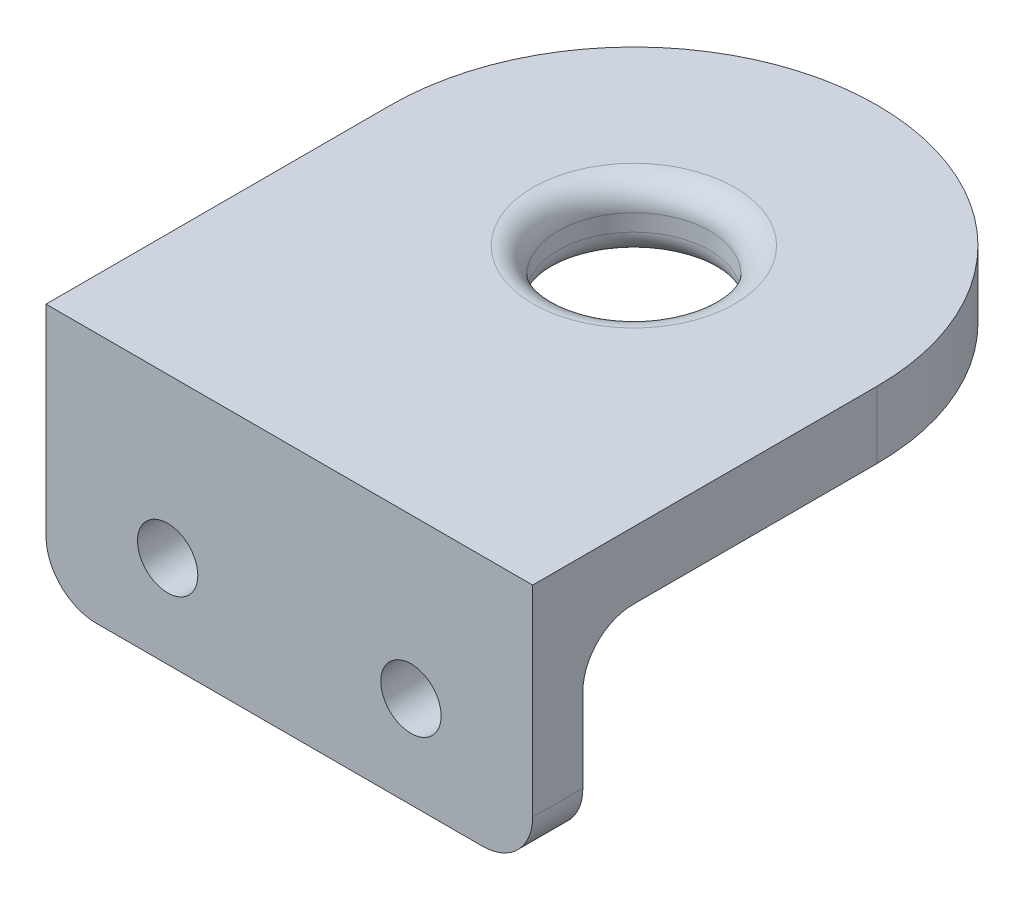
ISO-10303-21;
HEADER;
FILE_DESCRIPTION(('STEP AP214'),'2;1');
FILE_NAME('part.step','',(''),(''),'','','');
FILE_SCHEMA(('AUTOMOTIVE_DESIGN { 1 0 10303 214 1 1 1 1 }'));
ENDSEC;
DATA;
#1=APPLICATION_CONTEXT('core data for automotive mechanical design processes');
#2=APPLICATION_PROTOCOL_DEFINITION('international standard','automotive_design',2000,#1);
#3=PRODUCT_CONTEXT('',#1,'mechanical');
#4=PRODUCT('Part','Part','',(#3));
#5=PRODUCT_RELATED_PRODUCT_CATEGORY('part','',(#4));
#6=PRODUCT_DEFINITION_FORMATION('','',#4);
#7=PRODUCT_DEFINITION_CONTEXT('part definition',#1,'design');
#8=PRODUCT_DEFINITION('design','',#6,#7);
#9=PRODUCT_DEFINITION_SHAPE('','',#8);
#10=(LENGTH_UNIT() NAMED_UNIT(*) SI_UNIT(.MILLI.,.METRE.));
#11=(NAMED_UNIT(*) PLANE_ANGLE_UNIT() SI_UNIT($,.RADIAN.));
#12=(NAMED_UNIT(*) SI_UNIT($,.STERADIAN.) SOLID_ANGLE_UNIT());
#13=UNCERTAINTY_MEASURE_WITH_UNIT(LENGTH_MEASURE(1.E-05),#10,'distance_accuracy_value','');
#14=(GEOMETRIC_REPRESENTATION_CONTEXT(3) GLOBAL_UNCERTAINTY_ASSIGNED_CONTEXT((#13)) GLOBAL_UNIT_ASSIGNED_CONTEXT((#10,
#11,#12)) REPRESENTATION_CONTEXT('',''));
#15=CARTESIAN_POINT('',(0.,0.,0.));
#16=DIRECTION('',(0.,0.,1.));
#17=DIRECTION('',(1.,0.,0.));
#18=AXIS2_PLACEMENT_3D('',#15,#16,#17);
#19=CARTESIAN_POINT('',(0.,0.,-20.57));
#20=DIRECTION('',(0.,1.,0.));
#21=DIRECTION('',(0.,0.,1.));
#22=AXIS2_PLACEMENT_3D('',#19,#20,#21);
#23=PLANE('',#22);
#24=CARTESIAN_POINT('',(0.,0.,-20.57));
#25=DIRECTION('',(0.,1.,0.));
#26=DIRECTION('',(0.,0.,1.));
#27=AXIS2_PLACEMENT_3D('',#24,#25,#26);
#28=CIRCLE('',#27,6.025);
#29=CARTESIAN_POINT('',(0.,0.,-14.545));
#30=VERTEX_POINT('',#29);
#31=EDGE_CURVE('E161',#30,#30,#28,.T.);
#32=ORIENTED_EDGE('',*,*,#31,.T.);
#33=EDGE_LOOP('',(#32));
#34=FACE_BOUND('',#33,.T.);
#35=DIRECTION('',(0.,0.,-1.));
#36=VECTOR('',#35,1.);
#37=CARTESIAN_POINT('',(14.525,0.,0.));
#38=LINE('',#37,#36);
#39=CARTESIAN_POINT('',(14.525,0.,-6.));
#40=VERTEX_POINT('',#39);
#41=CARTESIAN_POINT('',(14.525,0.,-20.57));
#42=VERTEX_POINT('',#41);
#43=EDGE_CURVE('E127',#40,#42,#38,.T.);
#44=ORIENTED_EDGE('',*,*,#43,.F.);
#45=DIRECTION('',(1.,0.,0.));
#46=VECTOR('',#45,1.);
#47=CARTESIAN_POINT('',(-14.525,0.,-6.));
#48=LINE('',#47,#46);
#49=CARTESIAN_POINT('',(-14.525,0.,-6.));
#50=VERTEX_POINT('',#49);
#51=EDGE_CURVE('E156',#40,#50,#48,.F.);
#52=ORIENTED_EDGE('',*,*,#51,.T.);
#53=DIRECTION('',(0.,0.,1.));
#54=VECTOR('',#53,1.);
#55=CARTESIAN_POINT('',(-14.525,0.,-20.57));
#56=LINE('',#55,#54);
#57=CARTESIAN_POINT('',(-14.525,0.,-20.57));
#58=VERTEX_POINT('',#57);
#59=EDGE_CURVE('E181',#58,#50,#56,.T.);
#60=ORIENTED_EDGE('',*,*,#59,.F.);
#61=CARTESIAN_POINT('',(0.,0.,-20.57));
#62=DIRECTION('',(0.,1.,0.));
#63=DIRECTION('',(0.,0.,1.));
#64=AXIS2_PLACEMENT_3D('',#61,#62,#63);
#65=CIRCLE('',#64,14.525);
#66=EDGE_CURVE('E131',#42,#58,#65,.T.);
#67=ORIENTED_EDGE('',*,*,#66,.F.);
#68=EDGE_LOOP('',(#44,#52,#60,#67));
#69=FACE_BOUND('',#68,.T.);
#70=ADVANCED_FACE('F33',(#34,#69),#23,.F.);
#71=CARTESIAN_POINT('',(0.,4.,-20.57));
#72=DIRECTION('',(0.,1.,0.));
#73=DIRECTION('',(0.,0.,1.));
#74=AXIS2_PLACEMENT_3D('',#71,#72,#73);
#75=PLANE('',#74);
#76=CARTESIAN_POINT('',(0.,4.,-20.57));
#77=DIRECTION('',(0.,1.,0.));
#78=DIRECTION('',(0.,0.,1.));
#79=AXIS2_PLACEMENT_3D('',#76,#77,#78);
#80=CIRCLE('',#79,6.025);
#81=CARTESIAN_POINT('',(0.,4.,-14.545));
#82=VERTEX_POINT('',#81);
#83=EDGE_CURVE('E11',#82,#82,#80,.F.);
#84=ORIENTED_EDGE('',*,*,#83,.T.);
#85=EDGE_LOOP('',(#84));
#86=FACE_BOUND('',#85,.T.);
#87=DIRECTION('',(0.,0.,-1.));
#88=VECTOR('',#87,1.);
#89=CARTESIAN_POINT('',(14.525,4.,0.));
#90=LINE('',#89,#88);
#91=CARTESIAN_POINT('',(14.525,4.,0.));
#92=VERTEX_POINT('',#91);
#93=CARTESIAN_POINT('',(14.525,4.,-20.57));
#94=VERTEX_POINT('',#93);
#95=EDGE_CURVE('E123',#92,#94,#90,.T.);
#96=ORIENTED_EDGE('',*,*,#95,.T.);
#97=CARTESIAN_POINT('',(0.,4.,-20.57));
#98=DIRECTION('',(0.,1.,0.));
#99=DIRECTION('',(0.,0.,1.));
#100=AXIS2_PLACEMENT_3D('',#97,#98,#99);
#101=CIRCLE('',#100,14.525);
#102=CARTESIAN_POINT('',(-14.525,4.,-20.57));
#103=VERTEX_POINT('',#102);
#104=EDGE_CURVE('E118',#94,#103,#101,.T.);
#105=ORIENTED_EDGE('',*,*,#104,.T.);
#106=DIRECTION('',(0.,0.,1.));
#107=VECTOR('',#106,1.);
#108=CARTESIAN_POINT('',(-14.525,4.,-20.57));
#109=LINE('',#108,#107);
#110=CARTESIAN_POINT('',(-14.525,4.,0.));
#111=VERTEX_POINT('',#110);
#112=EDGE_CURVE('E104',#103,#111,#109,.T.);
#113=ORIENTED_EDGE('',*,*,#112,.T.);
#114=DIRECTION('',(1.,0.,0.));
#115=VECTOR('',#114,1.);
#116=CARTESIAN_POINT('',(-14.525,4.,0.));
#117=LINE('',#116,#115);
#118=EDGE_CURVE('E117',#111,#92,#117,.T.);
#119=ORIENTED_EDGE('',*,*,#118,.T.);
#120=EDGE_LOOP('',(#96,#105,#113,#119));
#121=FACE_BOUND('',#120,.T.);
#122=ADVANCED_FACE('F121',(#86,#121),#75,.T.);
#123=CARTESIAN_POINT('',(0.,4.,-20.57));
#124=DIRECTION('',(0.,-1.,0.));
#125=DIRECTION('',(0.,0.,-1.));
#126=AXIS2_PLACEMENT_3D('',#123,#124,#125);
#127=CYLINDRICAL_SURFACE('',#126,14.525);
#128=ORIENTED_EDGE('',*,*,#66,.T.);
#129=DIRECTION('',(0.,-1.,0.));
#130=VECTOR('',#129,1.);
#131=CARTESIAN_POINT('',(-14.525,4.,-20.57));
#132=LINE('',#131,#130);
#133=EDGE_CURVE('E110',#103,#58,#132,.T.);
#134=ORIENTED_EDGE('',*,*,#133,.F.);
#135=ORIENTED_EDGE('',*,*,#104,.F.);
#136=DIRECTION('',(0.,-1.,0.));
#137=VECTOR('',#136,1.);
#138=CARTESIAN_POINT('',(14.525,4.,-20.57));
#139=LINE('',#138,#137);
#140=EDGE_CURVE('E208',#94,#42,#139,.T.);
#141=ORIENTED_EDGE('',*,*,#140,.T.);
#142=EDGE_LOOP('',(#128,#134,#135,#141));
#143=FACE_BOUND('',#142,.T.);
#144=ADVANCED_FACE('F129',(#143),#127,.T.);
#145=CARTESIAN_POINT('',(-14.525,4.,-20.57));
#146=DIRECTION('',(1.,0.,0.));
#147=DIRECTION('',(0.,0.,-1.));
#148=AXIS2_PLACEMENT_3D('',#145,#146,#147);
#149=PLANE('',#148);
#150=DIRECTION('',(0.,-1.,0.));
#151=VECTOR('',#150,1.);
#152=CARTESIAN_POINT('',(-14.525,4.,-3.));
#153=LINE('',#152,#151);
#154=CARTESIAN_POINT('',(-14.525,-3.,-3.));
#155=VERTEX_POINT('',#154);
#156=CARTESIAN_POINT('',(-14.525,-8.,-3.));
#157=VERTEX_POINT('',#156);
#158=EDGE_CURVE('E185',#155,#157,#153,.T.);
#159=ORIENTED_EDGE('',*,*,#158,.T.);
#160=DIRECTION('',(0.,0.,1.));
#161=VECTOR('',#160,1.);
#162=CARTESIAN_POINT('',(-14.525,-8.,0.));
#163=LINE('',#162,#161);
#164=CARTESIAN_POINT('',(-14.525,-8.,0.));
#165=VERTEX_POINT('',#164);
#166=EDGE_CURVE('E132',#157,#165,#163,.T.);
#167=ORIENTED_EDGE('',*,*,#166,.T.);
#168=DIRECTION('',(0.,-1.,0.));
#169=VECTOR('',#168,1.);
#170=CARTESIAN_POINT('',(-14.525,4.,0.));
#171=LINE('',#170,#169);
#172=EDGE_CURVE('E114',#111,#165,#171,.T.);
#173=ORIENTED_EDGE('',*,*,#172,.F.);
#174=ORIENTED_EDGE('',*,*,#112,.F.);
#175=ORIENTED_EDGE('',*,*,#133,.T.);
#176=ORIENTED_EDGE('',*,*,#59,.T.);
#177=CARTESIAN_POINT('',(-14.525,-3.,-6.));
#178=DIRECTION('',(1.,0.,0.));
#179=DIRECTION('',(0.,0.,-1.));
#180=AXIS2_PLACEMENT_3D('',#177,#178,#179);
#181=CIRCLE('',#180,3.);
#182=EDGE_CURVE('E159',#50,#155,#181,.T.);
#183=ORIENTED_EDGE('',*,*,#182,.T.);
#184=EDGE_LOOP('',(#159,#167,#173,#174,#175,#176,#183));
#185=FACE_BOUND('',#184,.T.);
#186=ADVANCED_FACE('F107',(#185),#149,.F.);
#187=CARTESIAN_POINT('',(-14.525,4.,0.));
#188=DIRECTION('',(0.,0.,-1.));
#189=DIRECTION('',(-1.,0.,0.));
#190=AXIS2_PLACEMENT_3D('',#187,#188,#189);
#191=PLANE('',#190);
#192=CARTESIAN_POINT('',(7.2625,-5.5,0.));
#193=DIRECTION('',(0.,0.,-1.));
#194=DIRECTION('',(-1.,0.,0.));
#195=AXIS2_PLACEMENT_3D('',#192,#193,#194);
#196=CIRCLE('',#195,1.8);
#197=CARTESIAN_POINT('',(5.4625,-5.5,0.));
#198=VERTEX_POINT('',#197);
#199=EDGE_CURVE('E199',#198,#198,#196,.T.);
#200=ORIENTED_EDGE('',*,*,#199,.T.);
#201=EDGE_LOOP('',(#200));
#202=FACE_BOUND('',#201,.T.);
#203=CARTESIAN_POINT('',(-7.2625,-5.5,0.));
#204=DIRECTION('',(0.,0.,-1.));
#205=DIRECTION('',(1.,0.,0.));
#206=AXIS2_PLACEMENT_3D('',#203,#204,#205);
#207=CIRCLE('',#206,1.8);
#208=CARTESIAN_POINT('',(-5.4625,-5.5,0.));
#209=VERTEX_POINT('',#208);
#210=EDGE_CURVE('E379',#209,#209,#207,.T.);
#211=ORIENTED_EDGE('',*,*,#210,.T.);
#212=EDGE_LOOP('',(#211));
#213=FACE_BOUND('',#212,.T.);
#214=ORIENTED_EDGE('',*,*,#172,.T.);
#215=CARTESIAN_POINT('',(-11.525,-8.,0.));
#216=DIRECTION('',(0.,0.,-1.));
#217=DIRECTION('',(-1.,0.,0.));
#218=AXIS2_PLACEMENT_3D('',#215,#216,#217);
#219=CIRCLE('',#218,3.);
#220=CARTESIAN_POINT('',(-11.525,-11.,0.));
#221=VERTEX_POINT('',#220);
#222=EDGE_CURVE('E141',#165,#221,#219,.F.);
#223=ORIENTED_EDGE('',*,*,#222,.T.);
#224=DIRECTION('',(1.,0.,0.));
#225=VECTOR('',#224,1.);
#226=CARTESIAN_POINT('',(-14.525,-11.,0.));
#227=LINE('',#226,#225);
#228=CARTESIAN_POINT('',(11.525,-11.,0.));
#229=VERTEX_POINT('',#228);
#230=EDGE_CURVE('E193',#221,#229,#227,.T.);
#231=ORIENTED_EDGE('',*,*,#230,.T.);
#232=CARTESIAN_POINT('',(11.525,-8.,0.));
#233=DIRECTION('',(0.,0.,-1.));
#234=DIRECTION('',(-1.,0.,0.));
#235=AXIS2_PLACEMENT_3D('',#232,#233,#234);
#236=CIRCLE('',#235,3.);
#237=CARTESIAN_POINT('',(14.525,-8.,0.));
#238=VERTEX_POINT('',#237);
#239=EDGE_CURVE('E134',#229,#238,#236,.F.);
#240=ORIENTED_EDGE('',*,*,#239,.T.);
#241=DIRECTION('',(0.,-1.,0.));
#242=VECTOR('',#241,1.);
#243=CARTESIAN_POINT('',(14.525,4.,0.));
#244=LINE('',#243,#242);
#245=EDGE_CURVE('E136',#92,#238,#244,.T.);
#246=ORIENTED_EDGE('',*,*,#245,.F.);
#247=ORIENTED_EDGE('',*,*,#118,.F.);
#248=EDGE_LOOP('',(#214,#223,#231,#240,#246,#247));
#249=FACE_BOUND('',#248,.T.);
#250=ADVANCED_FACE('F226',(#202,#213,#249),#191,.F.);
#251=CARTESIAN_POINT('',(14.525,4.,0.));
#252=DIRECTION('',(-1.,0.,0.));
#253=DIRECTION('',(0.,0.,1.));
#254=AXIS2_PLACEMENT_3D('',#251,#252,#253);
#255=PLANE('',#254);
#256=ORIENTED_EDGE('',*,*,#245,.T.);
#257=DIRECTION('',(0.,0.,1.));
#258=VECTOR('',#257,1.);
#259=CARTESIAN_POINT('',(14.525,-8.,-3.));
#260=LINE('',#259,#258);
#261=CARTESIAN_POINT('',(14.525,-8.,-3.));
#262=VERTEX_POINT('',#261);
#263=EDGE_CURVE('E154',#238,#262,#260,.F.);
#264=ORIENTED_EDGE('',*,*,#263,.T.);
#265=DIRECTION('',(0.,1.,0.));
#266=VECTOR('',#265,1.);
#267=CARTESIAN_POINT('',(14.525,4.,-3.));
#268=LINE('',#267,#266);
#269=CARTESIAN_POINT('',(14.525,-3.,-3.));
#270=VERTEX_POINT('',#269);
#271=EDGE_CURVE('E196',#262,#270,#268,.T.);
#272=ORIENTED_EDGE('',*,*,#271,.T.);
#273=CARTESIAN_POINT('',(14.525,-3.,-6.));
#274=DIRECTION('',(-1.,0.,0.));
#275=DIRECTION('',(0.,0.,1.));
#276=AXIS2_PLACEMENT_3D('',#273,#274,#275);
#277=CIRCLE('',#276,3.);
#278=EDGE_CURVE('E48',#270,#40,#277,.T.);
#279=ORIENTED_EDGE('',*,*,#278,.T.);
#280=ORIENTED_EDGE('',*,*,#43,.T.);
#281=ORIENTED_EDGE('',*,*,#140,.F.);
#282=ORIENTED_EDGE('',*,*,#95,.F.);
#283=EDGE_LOOP('',(#256,#264,#272,#279,#280,#281,#282));
#284=FACE_BOUND('',#283,.T.);
#285=ADVANCED_FACE('F214',(#284),#255,.F.);
#286=CARTESIAN_POINT('',(0.,4.,-20.57));
#287=DIRECTION('',(0.,-1.,0.));
#288=DIRECTION('',(0.,0.,-1.));
#289=AXIS2_PLACEMENT_3D('',#286,#287,#288);
#290=CYLINDRICAL_SURFACE('',#289,4.525);
#291=CARTESIAN_POINT('',(0.,1.5,-20.57));
#292=DIRECTION('',(0.,1.,0.));
#293=DIRECTION('',(0.,0.,1.));
#294=AXIS2_PLACEMENT_3D('',#291,#292,#293);
#295=CIRCLE('',#294,4.525);
#296=CARTESIAN_POINT('',(0.,1.5,-16.045));
#297=VERTEX_POINT('',#296);
#298=EDGE_CURVE('E41',#297,#297,#295,.F.);
#299=ORIENTED_EDGE('',*,*,#298,.T.);
#300=EDGE_LOOP('',(#299));
#301=FACE_BOUND('',#300,.T.);
#302=CARTESIAN_POINT('',(0.,2.5,-20.57));
#303=DIRECTION('',(0.,1.,0.));
#304=DIRECTION('',(0.,0.,1.));
#305=AXIS2_PLACEMENT_3D('',#302,#303,#304);
#306=CIRCLE('',#305,4.525);
#307=CARTESIAN_POINT('',(0.,2.5,-16.045));
#308=VERTEX_POINT('',#307);
#309=EDGE_CURVE('E164',#308,#308,#306,.T.);
#310=ORIENTED_EDGE('',*,*,#309,.T.);
#311=EDGE_LOOP('',(#310));
#312=FACE_BOUND('',#311,.T.);
#313=ADVANCED_FACE('F169',(#301,#312),#290,.F.);
#314=CARTESIAN_POINT('',(0.,0.,-3.));
#315=DIRECTION('',(0.,0.,1.));
#316=DIRECTION('',(1.,0.,0.));
#317=AXIS2_PLACEMENT_3D('',#314,#315,#316);
#318=PLANE('',#317);
#319=CARTESIAN_POINT('',(7.2625,-5.5,-3.));
#320=DIRECTION('',(0.,0.,-1.));
#321=DIRECTION('',(-1.,0.,0.));
#322=AXIS2_PLACEMENT_3D('',#319,#320,#321);
#323=CIRCLE('',#322,1.8);
#324=CARTESIAN_POINT('',(5.4625,-5.5,-3.));
#325=VERTEX_POINT('',#324);
#326=EDGE_CURVE('E375',#325,#325,#323,.T.);
#327=ORIENTED_EDGE('',*,*,#326,.F.);
#328=EDGE_LOOP('',(#327));
#329=FACE_BOUND('',#328,.T.);
#330=CARTESIAN_POINT('',(-7.2625,-5.5,-3.));
#331=DIRECTION('',(0.,0.,-1.));
#332=DIRECTION('',(1.,0.,0.));
#333=AXIS2_PLACEMENT_3D('',#330,#331,#332);
#334=CIRCLE('',#333,1.8);
#335=CARTESIAN_POINT('',(-5.4625,-5.5,-3.));
#336=VERTEX_POINT('',#335);
#337=EDGE_CURVE('E202',#336,#336,#334,.T.);
#338=ORIENTED_EDGE('',*,*,#337,.F.);
#339=EDGE_LOOP('',(#338));
#340=FACE_BOUND('',#339,.T.);
#341=DIRECTION('',(1.,0.,0.));
#342=VECTOR('',#341,1.);
#343=CARTESIAN_POINT('',(-14.525,-11.,-3.));
#344=LINE('',#343,#342);
#345=CARTESIAN_POINT('',(-11.525,-11.,-3.));
#346=VERTEX_POINT('',#345);
#347=CARTESIAN_POINT('',(11.525,-11.,-3.));
#348=VERTEX_POINT('',#347);
#349=EDGE_CURVE('E192',#346,#348,#344,.T.);
#350=ORIENTED_EDGE('',*,*,#349,.F.);
#351=CARTESIAN_POINT('',(-11.525,-8.,-3.));
#352=DIRECTION('',(0.,0.,1.));
#353=DIRECTION('',(1.,0.,0.));
#354=AXIS2_PLACEMENT_3D('',#351,#352,#353);
#355=CIRCLE('',#354,3.);
#356=EDGE_CURVE('E152',#346,#157,#355,.F.);
#357=ORIENTED_EDGE('',*,*,#356,.T.);
#358=ORIENTED_EDGE('',*,*,#158,.F.);
#359=DIRECTION('',(1.,0.,0.));
#360=VECTOR('',#359,1.);
#361=CARTESIAN_POINT('',(14.525,-3.,-3.));
#362=LINE('',#361,#360);
#363=EDGE_CURVE('E148',#155,#270,#362,.T.);
#364=ORIENTED_EDGE('',*,*,#363,.T.);
#365=ORIENTED_EDGE('',*,*,#271,.F.);
#366=CARTESIAN_POINT('',(11.525,-8.,-3.));
#367=DIRECTION('',(0.,0.,1.));
#368=DIRECTION('',(1.,0.,0.));
#369=AXIS2_PLACEMENT_3D('',#366,#367,#368);
#370=CIRCLE('',#369,3.);
#371=EDGE_CURVE('E150',#262,#348,#370,.F.);
#372=ORIENTED_EDGE('',*,*,#371,.T.);
#373=EDGE_LOOP('',(#350,#357,#358,#364,#365,#372));
#374=FACE_BOUND('',#373,.T.);
#375=ADVANCED_FACE('F189',(#329,#340,#374),#318,.F.);
#376=CARTESIAN_POINT('',(-14.525,-11.,-3.));
#377=DIRECTION('',(0.,-1.,0.));
#378=DIRECTION('',(0.,0.,-1.));
#379=AXIS2_PLACEMENT_3D('',#376,#377,#378);
#380=PLANE('',#379);
#381=ORIENTED_EDGE('',*,*,#230,.F.);
#382=DIRECTION('',(0.,0.,1.));
#383=VECTOR('',#382,1.);
#384=CARTESIAN_POINT('',(-11.525,-11.,-3.));
#385=LINE('',#384,#383);
#386=EDGE_CURVE('E146',#221,#346,#385,.F.);
#387=ORIENTED_EDGE('',*,*,#386,.T.);
#388=ORIENTED_EDGE('',*,*,#349,.T.);
#389=DIRECTION('',(0.,0.,1.));
#390=VECTOR('',#389,1.);
#391=CARTESIAN_POINT('',(11.525,-11.,0.));
#392=LINE('',#391,#390);
#393=EDGE_CURVE('E143',#348,#229,#392,.T.);
#394=ORIENTED_EDGE('',*,*,#393,.T.);
#395=EDGE_LOOP('',(#381,#387,#388,#394));
#396=FACE_BOUND('',#395,.T.);
#397=ADVANCED_FACE('F222',(#396),#380,.T.);
#398=CARTESIAN_POINT('',(-7.2625,-5.5,0.));
#399=DIRECTION('',(0.,0.,-1.));
#400=DIRECTION('',(-1.,0.,0.));
#401=AXIS2_PLACEMENT_3D('',#398,#399,#400);
#402=CYLINDRICAL_SURFACE('',#401,1.8);
#403=ORIENTED_EDGE('',*,*,#210,.F.);
#404=EDGE_LOOP('',(#403));
#405=FACE_BOUND('',#404,.T.);
#406=ORIENTED_EDGE('',*,*,#337,.T.);
#407=EDGE_LOOP('',(#406));
#408=FACE_BOUND('',#407,.T.);
#409=ADVANCED_FACE('F287',(#405,#408),#402,.F.);
#410=CARTESIAN_POINT('',(7.2625,-5.5,0.));
#411=DIRECTION('',(0.,0.,-1.));
#412=DIRECTION('',(-1.,0.,0.));
#413=AXIS2_PLACEMENT_3D('',#410,#411,#412);
#414=CYLINDRICAL_SURFACE('',#413,1.8);
#415=ORIENTED_EDGE('',*,*,#199,.F.);
#416=EDGE_LOOP('',(#415));
#417=FACE_BOUND('',#416,.T.);
#418=ORIENTED_EDGE('',*,*,#326,.T.);
#419=EDGE_LOOP('',(#418));
#420=FACE_BOUND('',#419,.T.);
#421=ADVANCED_FACE('F243',(#417,#420),#414,.F.);
#422=CARTESIAN_POINT('',(-11.525,-8.,-20.57));
#423=DIRECTION('',(0.,0.,-1.));
#424=DIRECTION('',(-1.,0.,0.));
#425=AXIS2_PLACEMENT_3D('',#422,#423,#424);
#426=CYLINDRICAL_SURFACE('',#425,3.);
#427=ORIENTED_EDGE('',*,*,#356,.F.);
#428=ORIENTED_EDGE('',*,*,#386,.F.);
#429=ORIENTED_EDGE('',*,*,#222,.F.);
#430=ORIENTED_EDGE('',*,*,#166,.F.);
#431=EDGE_LOOP('',(#427,#428,#429,#430));
#432=FACE_BOUND('',#431,.T.);
#433=ADVANCED_FACE('F225',(#432),#426,.T.);
#434=CARTESIAN_POINT('',(11.525,-8.,-3.));
#435=DIRECTION('',(0.,0.,-1.));
#436=DIRECTION('',(-1.,0.,0.));
#437=AXIS2_PLACEMENT_3D('',#434,#435,#436);
#438=CYLINDRICAL_SURFACE('',#437,3.);
#439=ORIENTED_EDGE('',*,*,#371,.F.);
#440=ORIENTED_EDGE('',*,*,#263,.F.);
#441=ORIENTED_EDGE('',*,*,#239,.F.);
#442=ORIENTED_EDGE('',*,*,#393,.F.);
#443=EDGE_LOOP('',(#439,#440,#441,#442));
#444=FACE_BOUND('',#443,.T.);
#445=ADVANCED_FACE('F218',(#444),#438,.T.);
#446=CARTESIAN_POINT('',(0.,-3.,-6.));
#447=DIRECTION('',(-1.,0.,0.));
#448=DIRECTION('',(0.,0.,1.));
#449=AXIS2_PLACEMENT_3D('',#446,#447,#448);
#450=CYLINDRICAL_SURFACE('',#449,3.);
#451=ORIENTED_EDGE('',*,*,#182,.F.);
#452=ORIENTED_EDGE('',*,*,#51,.F.);
#453=ORIENTED_EDGE('',*,*,#278,.F.);
#454=ORIENTED_EDGE('',*,*,#363,.F.);
#455=EDGE_LOOP('',(#451,#452,#453,#454));
#456=FACE_BOUND('',#455,.T.);
#457=ADVANCED_FACE('F175',(#456),#450,.F.);
#458=CARTESIAN_POINT('',(0.,1.5,-20.57));
#459=DIRECTION('',(0.,1.,0.));
#460=DIRECTION('',(0.,0.,1.));
#461=AXIS2_PLACEMENT_3D('',#458,#459,#460);
#462=TOROIDAL_SURFACE('',#461,6.025,1.5);
#463=ORIENTED_EDGE('',*,*,#298,.F.);
#464=EDGE_LOOP('',(#463));
#465=FACE_BOUND('',#464,.T.);
#466=ORIENTED_EDGE('',*,*,#31,.F.);
#467=EDGE_LOOP('',(#466));
#468=FACE_BOUND('',#467,.T.);
#469=ADVANCED_FACE('F172',(#465,#468),#462,.T.);
#470=CARTESIAN_POINT('',(0.,2.5,-20.57));
#471=DIRECTION('',(0.,1.,0.));
#472=DIRECTION('',(0.,0.,1.));
#473=AXIS2_PLACEMENT_3D('',#470,#471,#472);
#474=TOROIDAL_SURFACE('',#473,6.025,1.5);
#475=ORIENTED_EDGE('',*,*,#83,.F.);
#476=EDGE_LOOP('',(#475));
#477=FACE_BOUND('',#476,.T.);
#478=ORIENTED_EDGE('',*,*,#309,.F.);
#479=EDGE_LOOP('',(#478));
#480=FACE_BOUND('',#479,.T.);
#481=ADVANCED_FACE('F35',(#477,#480),#474,.T.);
#482=CLOSED_SHELL('',(#70,#122,#144,#186,#250,#285,#313,#375,#397,#409,#421,#433,#445,#457,#469,#481));
#483=MANIFOLD_SOLID_BREP('B2',#482);
#484=ADVANCED_BREP_SHAPE_REPRESENTATION('',(#18,#483),#14);
#485=SHAPE_DEFINITION_REPRESENTATION(#9,#484);
ENDSEC;
END-ISO-10303-21;
